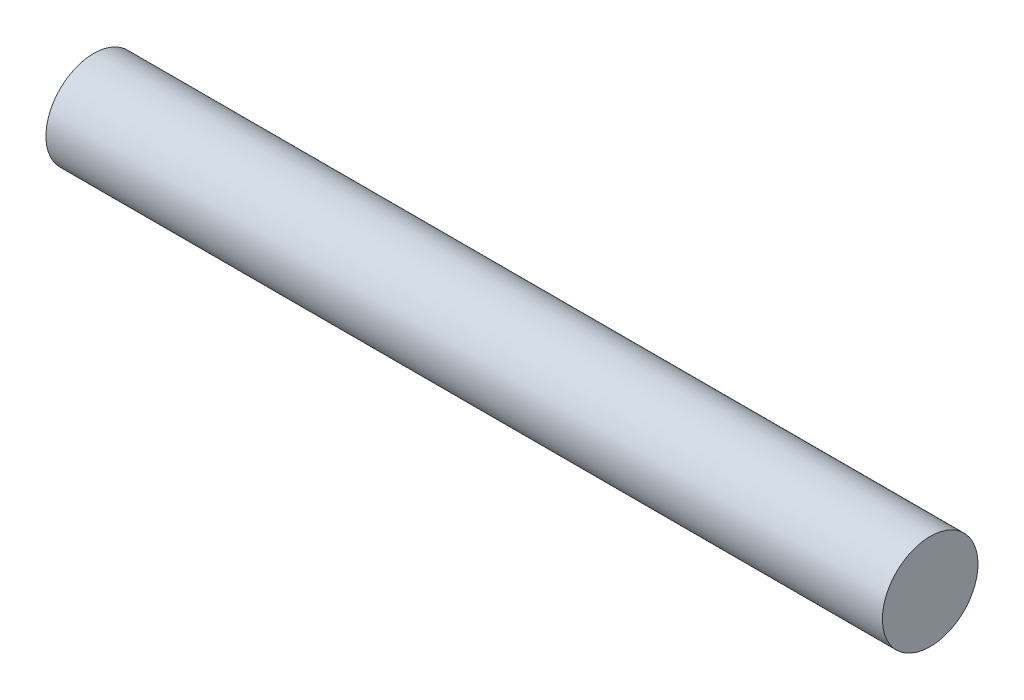
ISO-10303-21;
HEADER;
FILE_DESCRIPTION(('STEP AP214'),'2;1');
FILE_NAME('part.step','',(''),(''),'','','');
FILE_SCHEMA(('AUTOMOTIVE_DESIGN { 1 0 10303 214 1 1 1 1 }'));
ENDSEC;
DATA;
#1=APPLICATION_CONTEXT('core data for automotive mechanical design processes');
#2=APPLICATION_PROTOCOL_DEFINITION('international standard','automotive_design',2000,#1);
#3=PRODUCT_CONTEXT('',#1,'mechanical');
#4=PRODUCT('Part','Part','',(#3));
#5=PRODUCT_RELATED_PRODUCT_CATEGORY('part','',(#4));
#6=PRODUCT_DEFINITION_FORMATION('','',#4);
#7=PRODUCT_DEFINITION_CONTEXT('part definition',#1,'design');
#8=PRODUCT_DEFINITION('design','',#6,#7);
#9=PRODUCT_DEFINITION_SHAPE('','',#8);
#10=(LENGTH_UNIT() NAMED_UNIT(*) SI_UNIT(.MILLI.,.METRE.));
#11=(NAMED_UNIT(*) PLANE_ANGLE_UNIT() SI_UNIT($,.RADIAN.));
#12=(NAMED_UNIT(*) SI_UNIT($,.STERADIAN.) SOLID_ANGLE_UNIT());
#13=UNCERTAINTY_MEASURE_WITH_UNIT(LENGTH_MEASURE(1.E-05),#10,'distance_accuracy_value','');
#14=(GEOMETRIC_REPRESENTATION_CONTEXT(3) GLOBAL_UNCERTAINTY_ASSIGNED_CONTEXT((#13)) GLOBAL_UNIT_ASSIGNED_CONTEXT((#10,
#11,#12)) REPRESENTATION_CONTEXT('',''));
#15=CARTESIAN_POINT('',(0.,0.,0.));
#16=DIRECTION('',(0.,0.,1.));
#17=DIRECTION('',(1.,0.,0.));
#18=AXIS2_PLACEMENT_3D('',#15,#16,#17);
#19=CARTESIAN_POINT('',(140.,0.,0.));
#20=DIRECTION('',(-1.,0.,0.));
#21=DIRECTION('',(0.,0.,1.));
#22=AXIS2_PLACEMENT_3D('',#19,#20,#21);
#23=CYLINDRICAL_SURFACE('',#22,8.);
#24=CARTESIAN_POINT('',(140.,0.,0.));
#25=DIRECTION('',(1.,0.,0.));
#26=DIRECTION('',(0.,0.,-1.));
#27=AXIS2_PLACEMENT_3D('',#24,#25,#26);
#28=CIRCLE('',#27,8.);
#29=CARTESIAN_POINT('',(140.,0.,-8.));
#30=VERTEX_POINT('',#29);
#31=EDGE_CURVE('E10',#30,#30,#28,.T.);
#32=ORIENTED_EDGE('',*,*,#31,.F.);
#33=EDGE_LOOP('',(#32));
#34=FACE_BOUND('',#33,.T.);
#35=CARTESIAN_POINT('',(0.,0.,0.));
#36=DIRECTION('',(1.,0.,0.));
#37=DIRECTION('',(0.,0.,-1.));
#38=AXIS2_PLACEMENT_3D('',#35,#36,#37);
#39=CIRCLE('',#38,8.);
#40=CARTESIAN_POINT('',(0.,0.,-8.));
#41=VERTEX_POINT('',#40);
#42=EDGE_CURVE('E44',#41,#41,#39,.T.);
#43=ORIENTED_EDGE('',*,*,#42,.T.);
#44=EDGE_LOOP('',(#43));
#45=FACE_BOUND('',#44,.T.);
#46=ADVANCED_FACE('F41',(#34,#45),#23,.T.);
#47=CARTESIAN_POINT('',(140.,0.,0.));
#48=DIRECTION('',(1.,0.,0.));
#49=DIRECTION('',(0.,0.,-1.));
#50=AXIS2_PLACEMENT_3D('',#47,#48,#49);
#51=PLANE('',#50);
#52=ORIENTED_EDGE('',*,*,#31,.T.);
#53=EDGE_LOOP('',(#52));
#54=FACE_BOUND('',#53,.T.);
#55=ADVANCED_FACE('F58',(#54),#51,.T.);
#56=CARTESIAN_POINT('',(0.,0.,0.));
#57=DIRECTION('',(1.,0.,0.));
#58=DIRECTION('',(0.,0.,-1.));
#59=AXIS2_PLACEMENT_3D('',#56,#57,#58);
#60=PLANE('',#59);
#61=ORIENTED_EDGE('',*,*,#42,.F.);
#62=EDGE_LOOP('',(#61));
#63=FACE_BOUND('',#62,.T.);
#64=ADVANCED_FACE('F56',(#63),#60,.F.);
#65=CLOSED_SHELL('',(#46,#55,#64));
#66=MANIFOLD_SOLID_BREP('B2',#65);
#67=ADVANCED_BREP_SHAPE_REPRESENTATION('',(#18,#66),#14);
#68=SHAPE_DEFINITION_REPRESENTATION(#9,#67);
ENDSEC;
END-ISO-10303-21;
